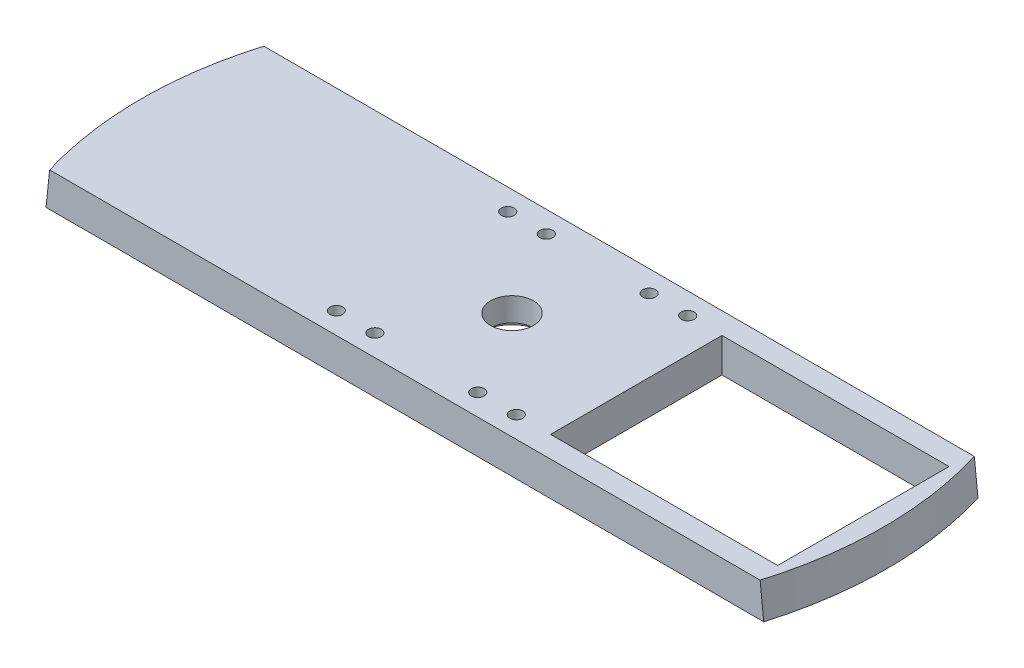
ISO-10303-21;
HEADER;
FILE_DESCRIPTION(('STEP AP214'),'2;1');
FILE_NAME('part.step','',(''),(''),'','','');
FILE_SCHEMA(('AUTOMOTIVE_DESIGN { 1 0 10303 214 1 1 1 1 }'));
ENDSEC;
DATA;
#1=APPLICATION_CONTEXT('core data for automotive mechanical design processes');
#2=APPLICATION_PROTOCOL_DEFINITION('international standard','automotive_design',2000,#1);
#3=PRODUCT_CONTEXT('',#1,'mechanical');
#4=PRODUCT('Part','Part','',(#3));
#5=PRODUCT_RELATED_PRODUCT_CATEGORY('part','',(#4));
#6=PRODUCT_DEFINITION_FORMATION('','',#4);
#7=PRODUCT_DEFINITION_CONTEXT('part definition',#1,'design');
#8=PRODUCT_DEFINITION('design','',#6,#7);
#9=PRODUCT_DEFINITION_SHAPE('','',#8);
#10=(LENGTH_UNIT() NAMED_UNIT(*) SI_UNIT(.MILLI.,.METRE.));
#11=(NAMED_UNIT(*) PLANE_ANGLE_UNIT() SI_UNIT($,.RADIAN.));
#12=(NAMED_UNIT(*) SI_UNIT($,.STERADIAN.) SOLID_ANGLE_UNIT());
#13=UNCERTAINTY_MEASURE_WITH_UNIT(LENGTH_MEASURE(1.E-05),#10,'distance_accuracy_value','');
#14=(GEOMETRIC_REPRESENTATION_CONTEXT(3) GLOBAL_UNCERTAINTY_ASSIGNED_CONTEXT((#13)) GLOBAL_UNIT_ASSIGNED_CONTEXT((#10,
#11,#12)) REPRESENTATION_CONTEXT('',''));
#15=CARTESIAN_POINT('',(0.,0.,0.));
#16=DIRECTION('',(0.,0.,1.));
#17=DIRECTION('',(1.,0.,0.));
#18=AXIS2_PLACEMENT_3D('',#15,#16,#17);
#19=CARTESIAN_POINT('',(0.,64.142135623731,0.));
#20=DIRECTION('',(0.,-1.,0.));
#21=DIRECTION('',(1.,0.,0.));
#22=AXIS2_PLACEMENT_3D('',#19,#20,#21);
#23=CYLINDRICAL_SURFACE('',#22,5.);
#24=CARTESIAN_POINT('',(0.,50.,0.));
#25=DIRECTION('',(0.,1.,0.));
#26=DIRECTION('',(-1.,0.,0.));
#27=AXIS2_PLACEMENT_3D('',#24,#25,#26);
#28=CIRCLE('',#27,5.);
#29=CARTESIAN_POINT('',(-5.00000000000001,50.,0.));
#30=VERTEX_POINT('',#29);
#31=EDGE_CURVE('E191',#30,#30,#28,.F.);
#32=ORIENTED_EDGE('',*,*,#31,.F.);
#33=EDGE_LOOP('',(#32));
#34=FACE_BOUND('',#33,.T.);
#35=CARTESIAN_POINT('',(0.,44.5,0.));
#36=DIRECTION('',(0.,-1.,0.));
#37=DIRECTION('',(1.,0.,0.));
#38=AXIS2_PLACEMENT_3D('',#35,#36,#37);
#39=CIRCLE('',#38,5.);
#40=CARTESIAN_POINT('',(4.99999999999999,44.5,0.));
#41=VERTEX_POINT('',#40);
#42=EDGE_CURVE('E39',#41,#41,#39,.F.);
#43=ORIENTED_EDGE('',*,*,#42,.F.);
#44=EDGE_LOOP('',(#43));
#45=FACE_BOUND('',#44,.T.);
#46=ADVANCED_FACE('F35',(#34,#45),#23,.F.);
#47=CARTESIAN_POINT('',(-87.4046785079811,42.,-25.));
#48=DIRECTION('',(0.,-1.,0.));
#49=DIRECTION('',(1.,0.,0.));
#50=AXIS2_PLACEMENT_3D('',#47,#48,#49);
#51=PLANE('',#50);
#52=DIRECTION('',(1.,0.,0.));
#53=VECTOR('',#52,1.);
#54=CARTESIAN_POINT('',(29.,42.,20.));
#55=LINE('',#54,#53);
#56=CARTESIAN_POINT('',(29.,42.,20.));
#57=VERTEX_POINT('',#56);
#58=CARTESIAN_POINT('',(82.,42.,20.));
#59=VERTEX_POINT('',#58);
#60=EDGE_CURVE('E115',#57,#59,#55,.T.);
#61=ORIENTED_EDGE('',*,*,#60,.T.);
#62=DIRECTION('',(0.,0.,-1.));
#63=VECTOR('',#62,1.);
#64=CARTESIAN_POINT('',(82.,42.,-20.));
#65=LINE('',#64,#63);
#66=CARTESIAN_POINT('',(82.,42.,-20.));
#67=VERTEX_POINT('',#66);
#68=EDGE_CURVE('E102',#59,#67,#65,.T.);
#69=ORIENTED_EDGE('',*,*,#68,.T.);
#70=DIRECTION('',(-1.,0.,0.));
#71=VECTOR('',#70,1.);
#72=CARTESIAN_POINT('',(29.,42.,-20.));
#73=LINE('',#72,#71);
#74=CARTESIAN_POINT('',(29.,42.,-20.));
#75=VERTEX_POINT('',#74);
#76=EDGE_CURVE('E132',#67,#75,#73,.T.);
#77=ORIENTED_EDGE('',*,*,#76,.T.);
#78=DIRECTION('',(0.,0.,1.));
#79=VECTOR('',#78,1.);
#80=CARTESIAN_POINT('',(29.,42.,-20.));
#81=LINE('',#80,#79);
#82=EDGE_CURVE('E122',#75,#57,#81,.T.);
#83=ORIENTED_EDGE('',*,*,#82,.T.);
#84=EDGE_LOOP('',(#61,#69,#77,#83));
#85=FACE_BOUND('',#84,.T.);
#86=CARTESIAN_POINT('',(21.,42.,-20.));
#87=DIRECTION('',(0.,-1.,0.));
#88=DIRECTION('',(1.,0.,0.));
#89=AXIS2_PLACEMENT_3D('',#86,#87,#88);
#90=CIRCLE('',#89,1.5);
#91=CARTESIAN_POINT('',(22.5,42.,-20.));
#92=VERTEX_POINT('',#91);
#93=EDGE_CURVE('E137',#92,#92,#90,.T.);
#94=ORIENTED_EDGE('',*,*,#93,.F.);
#95=EDGE_LOOP('',(#94));
#96=FACE_BOUND('',#95,.T.);
#97=CARTESIAN_POINT('',(-21.,42.,-20.));
#98=DIRECTION('',(0.,-1.,0.));
#99=DIRECTION('',(1.,0.,0.));
#100=AXIS2_PLACEMENT_3D('',#97,#98,#99);
#101=CIRCLE('',#100,1.5);
#102=CARTESIAN_POINT('',(-19.5,42.,-20.));
#103=VERTEX_POINT('',#102);
#104=EDGE_CURVE('E143',#103,#103,#101,.T.);
#105=ORIENTED_EDGE('',*,*,#104,.F.);
#106=EDGE_LOOP('',(#105));
#107=FACE_BOUND('',#106,.T.);
#108=CARTESIAN_POINT('',(-21.,42.,20.));
#109=DIRECTION('',(0.,-1.,0.));
#110=DIRECTION('',(1.,0.,0.));
#111=AXIS2_PLACEMENT_3D('',#108,#109,#110);
#112=CIRCLE('',#111,1.5);
#113=CARTESIAN_POINT('',(-19.5,42.,20.));
#114=VERTEX_POINT('',#113);
#115=EDGE_CURVE('E149',#114,#114,#112,.T.);
#116=ORIENTED_EDGE('',*,*,#115,.F.);
#117=EDGE_LOOP('',(#116));
#118=FACE_BOUND('',#117,.T.);
#119=CARTESIAN_POINT('',(21.,42.,20.));
#120=DIRECTION('',(0.,-1.,0.));
#121=DIRECTION('',(1.,0.,0.));
#122=AXIS2_PLACEMENT_3D('',#119,#120,#121);
#123=CIRCLE('',#122,1.5);
#124=CARTESIAN_POINT('',(22.5,42.,20.));
#125=VERTEX_POINT('',#124);
#126=EDGE_CURVE('E155',#125,#125,#123,.T.);
#127=ORIENTED_EDGE('',*,*,#126,.F.);
#128=EDGE_LOOP('',(#127));
#129=FACE_BOUND('',#128,.T.);
#130=CARTESIAN_POINT('',(12.,42.,-20.));
#131=DIRECTION('',(0.,-1.,0.));
#132=DIRECTION('',(1.,0.,0.));
#133=AXIS2_PLACEMENT_3D('',#130,#131,#132);
#134=CIRCLE('',#133,1.5);
#135=CARTESIAN_POINT('',(13.5,42.,-20.));
#136=VERTEX_POINT('',#135);
#137=EDGE_CURVE('E161',#136,#136,#134,.T.);
#138=ORIENTED_EDGE('',*,*,#137,.F.);
#139=EDGE_LOOP('',(#138));
#140=FACE_BOUND('',#139,.T.);
#141=CARTESIAN_POINT('',(-12.,42.,-20.));
#142=DIRECTION('',(0.,-1.,0.));
#143=DIRECTION('',(1.,0.,0.));
#144=AXIS2_PLACEMENT_3D('',#141,#142,#143);
#145=CIRCLE('',#144,1.5);
#146=CARTESIAN_POINT('',(-10.5,42.,-20.));
#147=VERTEX_POINT('',#146);
#148=EDGE_CURVE('E167',#147,#147,#145,.T.);
#149=ORIENTED_EDGE('',*,*,#148,.F.);
#150=EDGE_LOOP('',(#149));
#151=FACE_BOUND('',#150,.T.);
#152=CARTESIAN_POINT('',(-12.,42.,20.));
#153=DIRECTION('',(0.,-1.,0.));
#154=DIRECTION('',(1.,0.,0.));
#155=AXIS2_PLACEMENT_3D('',#152,#153,#154);
#156=CIRCLE('',#155,1.5);
#157=CARTESIAN_POINT('',(-10.5,42.,20.));
#158=VERTEX_POINT('',#157);
#159=EDGE_CURVE('E173',#158,#158,#156,.T.);
#160=ORIENTED_EDGE('',*,*,#159,.F.);
#161=EDGE_LOOP('',(#160));
#162=FACE_BOUND('',#161,.T.);
#163=CARTESIAN_POINT('',(12.,42.,20.));
#164=DIRECTION('',(0.,-1.,0.));
#165=DIRECTION('',(1.,0.,0.));
#166=AXIS2_PLACEMENT_3D('',#163,#164,#165);
#167=CIRCLE('',#166,1.5);
#168=CARTESIAN_POINT('',(13.5,42.,20.));
#169=VERTEX_POINT('',#168);
#170=EDGE_CURVE('E179',#169,#169,#167,.T.);
#171=ORIENTED_EDGE('',*,*,#170,.F.);
#172=EDGE_LOOP('',(#171));
#173=FACE_BOUND('',#172,.T.);
#174=CARTESIAN_POINT('',(0.,42.,0.));
#175=DIRECTION('',(0.,-1.,0.));
#176=DIRECTION('',(1.,0.,0.));
#177=AXIS2_PLACEMENT_3D('',#174,#175,#176);
#178=CIRCLE('',#177,8.);
#179=CARTESIAN_POINT('',(7.99999999999999,42.,0.));
#180=VERTEX_POINT('',#179);
#181=EDGE_CURVE('E185',#180,#180,#178,.T.);
#182=ORIENTED_EDGE('',*,*,#181,.F.);
#183=EDGE_LOOP('',(#182));
#184=FACE_BOUND('',#183,.T.);
#185=CARTESIAN_POINT('',(0.,42.,0.));
#186=DIRECTION('',(0.,-1.,0.));
#187=DIRECTION('',(1.,0.,0.));
#188=AXIS2_PLACEMENT_3D('',#185,#186,#187);
#189=CIRCLE('',#188,87.4046785079811);
#190=CARTESIAN_POINT('',(-83.7530765111559,42.,25.));
#191=VERTEX_POINT('',#190);
#192=CARTESIAN_POINT('',(-83.7530765111559,42.,-25.));
#193=VERTEX_POINT('',#192);
#194=EDGE_CURVE('E199',#191,#193,#189,.T.);
#195=ORIENTED_EDGE('',*,*,#194,.T.);
#196=DIRECTION('',(1.,0.,0.));
#197=VECTOR('',#196,1.);
#198=CARTESIAN_POINT('',(-87.4046785079811,42.,-25.));
#199=LINE('',#198,#197);
#200=CARTESIAN_POINT('',(83.7530765111559,42.,-25.));
#201=VERTEX_POINT('',#200);
#202=EDGE_CURVE('E241',#193,#201,#199,.T.);
#203=ORIENTED_EDGE('',*,*,#202,.T.);
#204=CARTESIAN_POINT('',(83.7530765111559,42.,25.));
#205=VERTEX_POINT('',#204);
#206=EDGE_CURVE('E197',#201,#205,#189,.T.);
#207=ORIENTED_EDGE('',*,*,#206,.T.);
#208=DIRECTION('',(1.,0.,0.));
#209=VECTOR('',#208,1.);
#210=CARTESIAN_POINT('',(-87.4046785079811,42.,25.));
#211=LINE('',#210,#209);
#212=EDGE_CURVE('E246',#191,#205,#211,.T.);
#213=ORIENTED_EDGE('',*,*,#212,.F.);
#214=EDGE_LOOP('',(#195,#203,#207,#213));
#215=FACE_BOUND('',#214,.T.);
#216=ADVANCED_FACE('F37',(#85,#96,#107,#118,#129,#140,#151,#162,#173,#184,#215),#51,.T.);
#217=CARTESIAN_POINT('',(-86.5920681414426,50.,-25.));
#218=DIRECTION('',(0.,1.,0.));
#219=DIRECTION('',(-1.,0.,0.));
#220=AXIS2_PLACEMENT_3D('',#217,#218,#219);
#221=PLANE('',#220);
#222=DIRECTION('',(1.,0.,0.));
#223=VECTOR('',#222,1.);
#224=CARTESIAN_POINT('',(29.,50.,20.));
#225=LINE('',#224,#223);
#226=CARTESIAN_POINT('',(29.,50.,20.));
#227=VERTEX_POINT('',#226);
#228=CARTESIAN_POINT('',(82.,50.,20.));
#229=VERTEX_POINT('',#228);
#230=EDGE_CURVE('E118',#227,#229,#225,.T.);
#231=ORIENTED_EDGE('',*,*,#230,.F.);
#232=DIRECTION('',(0.,0.,1.));
#233=VECTOR('',#232,1.);
#234=CARTESIAN_POINT('',(29.,50.,-20.));
#235=LINE('',#234,#233);
#236=CARTESIAN_POINT('',(29.,50.,-20.));
#237=VERTEX_POINT('',#236);
#238=EDGE_CURVE('E128',#237,#227,#235,.T.);
#239=ORIENTED_EDGE('',*,*,#238,.F.);
#240=DIRECTION('',(-1.,0.,0.));
#241=VECTOR('',#240,1.);
#242=CARTESIAN_POINT('',(29.,50.,-20.));
#243=LINE('',#242,#241);
#244=CARTESIAN_POINT('',(82.,50.,-20.));
#245=VERTEX_POINT('',#244);
#246=EDGE_CURVE('E59',#245,#237,#243,.T.);
#247=ORIENTED_EDGE('',*,*,#246,.F.);
#248=DIRECTION('',(0.,0.,-1.));
#249=VECTOR('',#248,1.);
#250=CARTESIAN_POINT('',(82.,50.,-20.));
#251=LINE('',#250,#249);
#252=EDGE_CURVE('E124',#229,#245,#251,.T.);
#253=ORIENTED_EDGE('',*,*,#252,.F.);
#254=EDGE_LOOP('',(#231,#239,#247,#253));
#255=FACE_BOUND('',#254,.T.);
#256=CARTESIAN_POINT('',(21.,50.,-20.));
#257=DIRECTION('',(0.,1.,0.));
#258=DIRECTION('',(-1.,0.,0.));
#259=AXIS2_PLACEMENT_3D('',#256,#257,#258);
#260=CIRCLE('',#259,1.5);
#261=CARTESIAN_POINT('',(19.5,50.,-20.));
#262=VERTEX_POINT('',#261);
#263=EDGE_CURVE('E140',#262,#262,#260,.F.);
#264=ORIENTED_EDGE('',*,*,#263,.T.);
#265=EDGE_LOOP('',(#264));
#266=FACE_BOUND('',#265,.T.);
#267=CARTESIAN_POINT('',(-21.,50.,-20.));
#268=DIRECTION('',(0.,1.,0.));
#269=DIRECTION('',(-1.,0.,0.));
#270=AXIS2_PLACEMENT_3D('',#267,#268,#269);
#271=CIRCLE('',#270,1.5);
#272=CARTESIAN_POINT('',(-22.5,50.,-20.));
#273=VERTEX_POINT('',#272);
#274=EDGE_CURVE('E146',#273,#273,#271,.F.);
#275=ORIENTED_EDGE('',*,*,#274,.T.);
#276=EDGE_LOOP('',(#275));
#277=FACE_BOUND('',#276,.T.);
#278=CARTESIAN_POINT('',(-21.,50.,20.));
#279=DIRECTION('',(0.,1.,0.));
#280=DIRECTION('',(-1.,0.,0.));
#281=AXIS2_PLACEMENT_3D('',#278,#279,#280);
#282=CIRCLE('',#281,1.5);
#283=CARTESIAN_POINT('',(-22.5,50.,20.));
#284=VERTEX_POINT('',#283);
#285=EDGE_CURVE('E152',#284,#284,#282,.F.);
#286=ORIENTED_EDGE('',*,*,#285,.T.);
#287=EDGE_LOOP('',(#286));
#288=FACE_BOUND('',#287,.T.);
#289=CARTESIAN_POINT('',(21.,50.,20.));
#290=DIRECTION('',(0.,1.,0.));
#291=DIRECTION('',(-1.,0.,0.));
#292=AXIS2_PLACEMENT_3D('',#289,#290,#291);
#293=CIRCLE('',#292,1.5);
#294=CARTESIAN_POINT('',(19.5,50.,20.));
#295=VERTEX_POINT('',#294);
#296=EDGE_CURVE('E158',#295,#295,#293,.F.);
#297=ORIENTED_EDGE('',*,*,#296,.T.);
#298=EDGE_LOOP('',(#297));
#299=FACE_BOUND('',#298,.T.);
#300=CARTESIAN_POINT('',(12.,50.,-20.));
#301=DIRECTION('',(0.,1.,0.));
#302=DIRECTION('',(-1.,0.,0.));
#303=AXIS2_PLACEMENT_3D('',#300,#301,#302);
#304=CIRCLE('',#303,1.5);
#305=CARTESIAN_POINT('',(10.5,50.,-20.));
#306=VERTEX_POINT('',#305);
#307=EDGE_CURVE('E164',#306,#306,#304,.F.);
#308=ORIENTED_EDGE('',*,*,#307,.T.);
#309=EDGE_LOOP('',(#308));
#310=FACE_BOUND('',#309,.T.);
#311=CARTESIAN_POINT('',(-12.,50.,-20.));
#312=DIRECTION('',(0.,1.,0.));
#313=DIRECTION('',(-1.,0.,0.));
#314=AXIS2_PLACEMENT_3D('',#311,#312,#313);
#315=CIRCLE('',#314,1.5);
#316=CARTESIAN_POINT('',(-13.5,50.,-20.));
#317=VERTEX_POINT('',#316);
#318=EDGE_CURVE('E170',#317,#317,#315,.F.);
#319=ORIENTED_EDGE('',*,*,#318,.T.);
#320=EDGE_LOOP('',(#319));
#321=FACE_BOUND('',#320,.T.);
#322=CARTESIAN_POINT('',(-12.,50.,20.));
#323=DIRECTION('',(0.,1.,0.));
#324=DIRECTION('',(-1.,0.,0.));
#325=AXIS2_PLACEMENT_3D('',#322,#323,#324);
#326=CIRCLE('',#325,1.5);
#327=CARTESIAN_POINT('',(-13.5,50.,20.));
#328=VERTEX_POINT('',#327);
#329=EDGE_CURVE('E176',#328,#328,#326,.F.);
#330=ORIENTED_EDGE('',*,*,#329,.T.);
#331=EDGE_LOOP('',(#330));
#332=FACE_BOUND('',#331,.T.);
#333=CARTESIAN_POINT('',(12.,50.,20.));
#334=DIRECTION('',(0.,1.,0.));
#335=DIRECTION('',(-1.,0.,0.));
#336=AXIS2_PLACEMENT_3D('',#333,#334,#335);
#337=CIRCLE('',#336,1.5);
#338=CARTESIAN_POINT('',(10.5,50.,20.));
#339=VERTEX_POINT('',#338);
#340=EDGE_CURVE('E182',#339,#339,#337,.F.);
#341=ORIENTED_EDGE('',*,*,#340,.T.);
#342=EDGE_LOOP('',(#341));
#343=FACE_BOUND('',#342,.T.);
#344=ORIENTED_EDGE('',*,*,#31,.T.);
#345=EDGE_LOOP('',(#344));
#346=FACE_BOUND('',#345,.T.);
#347=CARTESIAN_POINT('',(0.,50.,0.));
#348=DIRECTION('',(0.,-1.,0.));
#349=DIRECTION('',(1.,0.,0.));
#350=AXIS2_PLACEMENT_3D('',#347,#348,#349);
#351=CIRCLE('',#350,86.5920681414425);
#352=CARTESIAN_POINT('',(82.9046818039381,50.,-25.));
#353=VERTEX_POINT('',#352);
#354=CARTESIAN_POINT('',(82.9046818039381,50.,25.));
#355=VERTEX_POINT('',#354);
#356=EDGE_CURVE('E194',#353,#355,#351,.T.);
#357=ORIENTED_EDGE('',*,*,#356,.F.);
#358=DIRECTION('',(-1.,0.,0.));
#359=VECTOR('',#358,1.);
#360=CARTESIAN_POINT('',(-86.5920681414426,50.,-25.));
#361=LINE('',#360,#359);
#362=CARTESIAN_POINT('',(-82.9046818039381,50.,-25.));
#363=VERTEX_POINT('',#362);
#364=EDGE_CURVE('E238',#353,#363,#361,.T.);
#365=ORIENTED_EDGE('',*,*,#364,.T.);
#366=CARTESIAN_POINT('',(-82.9046818039381,50.,25.));
#367=VERTEX_POINT('',#366);
#368=EDGE_CURVE('E196',#367,#363,#351,.T.);
#369=ORIENTED_EDGE('',*,*,#368,.F.);
#370=DIRECTION('',(-1.,0.,0.));
#371=VECTOR('',#370,1.);
#372=CARTESIAN_POINT('',(-86.5920681414426,50.,25.));
#373=LINE('',#372,#371);
#374=EDGE_CURVE('E244',#355,#367,#373,.T.);
#375=ORIENTED_EDGE('',*,*,#374,.F.);
#376=EDGE_LOOP('',(#357,#365,#369,#375));
#377=FACE_BOUND('',#376,.T.);
#378=ADVANCED_FACE('F259',(#255,#266,#277,#288,#299,#310,#321,#332,#343,#346,#377),#221,.T.);
#379=CARTESIAN_POINT('',(0.,0.,-25.));
#380=DIRECTION('',(0.,0.,1.));
#381=DIRECTION('',(1.,0.,0.));
#382=AXIS2_PLACEMENT_3D('',#379,#380,#381);
#383=PLANE('',#382);
#384=ORIENTED_EDGE('',*,*,#202,.F.);
#385=CARTESIAN_POINT('',(-99.6441362385158,-108.898983920911,-25.));
#386=CARTESIAN_POINT('',(-98.2755683494716,-95.8308591136206,-25.));
#387=CARTESIAN_POINT('',(-96.9053780668794,-82.7629040560096,-25.));
#388=CARTESIAN_POINT('',(-94.1612427251718,-56.6273878959122,-25.));
#389=CARTESIAN_POINT('',(-92.787297665969,-43.5598267934349,-25.));
#390=CARTESIAN_POINT('',(-90.0351439888024,-17.4251644667499,-25.));
#391=CARTESIAN_POINT('',(-88.6569353743825,-4.35806324216902,-25.));
#392=CARTESIAN_POINT('',(-85.8956145308367,21.7756210523798,-25.));
#393=CARTESIAN_POINT('',(-84.5125023017524,34.8422041223521,-25.));
#394=CARTESIAN_POINT('',(-81.7406059368029,60.9747752834534,-25.));
#395=CARTESIAN_POINT('',(-80.3518217981445,74.040763374286,-25.));
#396=CARTESIAN_POINT('',(-77.5676385833807,100.172034336622,-25.));
#397=CARTESIAN_POINT('',(-76.1722395075564,113.237317208156,-25.));
#398=CARTESIAN_POINT('',(-73.3736579130146,139.367060567633,-25.));
#399=CARTESIAN_POINT('',(-71.9704753879137,152.431521054894,-25.));
#400=CARTESIAN_POINT('',(-69.8587544551281,172.027464053339,-25.));
#401=CARTESIAN_POINT('',(-69.1536895648329,178.559320939387,-25.));
#402=CARTESIAN_POINT('',(-67.7410132325902,191.622759511745,-25.));
#403=CARTESIAN_POINT('',(-67.033401790566,198.154341198047,-25.));
#404=CARTESIAN_POINT('',(-66.3244016576602,204.685772279796,-25.));
#405=B_SPLINE_CURVE_WITH_KNOTS('',3,(#385,#386,#387,#388,#389,#390,#391,#392,#393,#394,#395,
#396,#397,#398,#399,#400,#401,#402,#403,#404),.UNSPECIFIED.,.F.,.F.,(4,2,2,2,2,2,2,2,2,4),(0.,
39.418774545404,78.8375500086314,118.256292715268,157.675035086381,197.093796871865,
236.512556981421,275.931349423553,295.64074871437,315.350148598059),.UNSPECIFIED.);
#406=EDGE_CURVE('E208',#193,#363,#405,.T.);
#407=ORIENTED_EDGE('',*,*,#406,.T.);
#408=ORIENTED_EDGE('',*,*,#364,.F.);
#409=CARTESIAN_POINT('',(66.3244016576602,204.685772279796,-25.));
#410=CARTESIAN_POINT('',(67.4822322752226,194.019377280341,-25.));
#411=CARTESIAN_POINT('',(68.6364052277135,183.352585860173,-25.));
#412=CARTESIAN_POINT('',(70.9383328111043,162.018311240133,-25.));
#413=CARTESIAN_POINT('',(72.0860874425014,151.350828040315,-25.));
#414=CARTESIAN_POINT('',(74.3760751410753,130.01527327905,-25.));
#415=CARTESIAN_POINT('',(75.518308210327,119.347201717825,-25.));
#416=CARTESIAN_POINT('',(77.7979496259795,98.0105430780764,-25.));
#417=CARTESIAN_POINT('',(78.9353579723444,87.3419559995486,-25.));
#418=CARTESIAN_POINT('',(80.5807914150479,71.8791219262765,-25.));
#419=CARTESIAN_POINT('',(81.0905061210802,67.08505464833,-25.));
#420=CARTESIAN_POINT('',(82.1091260353078,57.4968339175061,-25.));
#421=CARTESIAN_POINT('',(82.6180312434738,52.7026804646256,-25.));
#422=CARTESIAN_POINT('',(84.5125039953821,34.8421982765181,-25.));
#423=CARTESIAN_POINT('',(85.8956160916492,21.77560903587,-25.));
#424=CARTESIAN_POINT('',(88.65693766782,-4.35808770301016,-25.));
#425=CARTESIAN_POINT('',(90.0351471475785,-17.4251952012575,-25.));
#426=CARTESIAN_POINT('',(92.7873010202453,-43.5598578931548,-25.));
#427=CARTESIAN_POINT('',(94.1612454135997,-56.6274130867576,-25.));
#428=CARTESIAN_POINT('',(96.9053793738766,-82.7629169179596,-25.));
#429=CARTESIAN_POINT('',(98.2755689410331,-95.830865555534,-25.));
#430=CARTESIAN_POINT('',(99.6441362385159,-108.898983920911,-25.));
#431=B_SPLINE_CURVE_WITH_KNOTS('',3,(#409,#410,#411,#412,#413,#414,#415,#416,#417,#418,#419,
#420,#421,#422,#423,#424,#425,#426,#427,#428,#429,#430),.UNSPECIFIED.,.F.,.F.,(4,2,2,2,2,2,2,2,
2,2,4),(0.,32.1871540914093,64.3743056892512,96.5614451908537,128.748584931559,143.211849079579,
157.675113749277,197.093874321975,236.51263606191,275.931393678013,315.350148835658),.UNSPECIFIED.);
#432=EDGE_CURVE('E200',#353,#201,#431,.T.);
#433=ORIENTED_EDGE('',*,*,#432,.T.);
#434=EDGE_LOOP('',(#384,#407,#408,#433));
#435=FACE_BOUND('',#434,.T.);
#436=ADVANCED_FACE('F213',(#435),#383,.F.);
#437=CARTESIAN_POINT('',(0.,0.,25.));
#438=DIRECTION('',(0.,0.,1.));
#439=DIRECTION('',(1.,0.,0.));
#440=AXIS2_PLACEMENT_3D('',#437,#438,#439);
#441=PLANE('',#440);
#442=CARTESIAN_POINT('',(-99.6441362385158,-108.898983920911,25.));
#443=CARTESIAN_POINT('',(-98.2755683494716,-95.8308591136206,25.));
#444=CARTESIAN_POINT('',(-96.9053780668794,-82.7629040560096,25.));
#445=CARTESIAN_POINT('',(-94.1612427251718,-56.6273878959122,25.));
#446=CARTESIAN_POINT('',(-92.787297665969,-43.5598267934349,25.));
#447=CARTESIAN_POINT('',(-90.0351439888024,-17.4251644667499,25.));
#448=CARTESIAN_POINT('',(-88.6569353743825,-4.35806324216902,25.));
#449=CARTESIAN_POINT('',(-85.8956145308367,21.7756210523798,25.));
#450=CARTESIAN_POINT('',(-84.5125023017524,34.8422041223521,25.));
#451=CARTESIAN_POINT('',(-81.7406059368029,60.9747752834534,25.));
#452=CARTESIAN_POINT('',(-80.3518217981445,74.040763374286,25.));
#453=CARTESIAN_POINT('',(-77.5676385833807,100.172034336622,25.));
#454=CARTESIAN_POINT('',(-76.1722395075564,113.237317208156,25.));
#455=CARTESIAN_POINT('',(-73.3736579130146,139.367060567633,25.));
#456=CARTESIAN_POINT('',(-71.9704753879137,152.431521054894,25.));
#457=CARTESIAN_POINT('',(-69.8587544551281,172.027464053339,25.));
#458=CARTESIAN_POINT('',(-69.1536895648329,178.559320939387,25.));
#459=CARTESIAN_POINT('',(-67.7410132325902,191.622759511745,25.));
#460=CARTESIAN_POINT('',(-67.033401790566,198.154341198047,25.));
#461=CARTESIAN_POINT('',(-66.3244016576602,204.685772279796,25.));
#462=B_SPLINE_CURVE_WITH_KNOTS('',3,(#442,#443,#444,#445,#446,#447,#448,#449,#450,#451,#452,
#453,#454,#455,#456,#457,#458,#459,#460,#461),.UNSPECIFIED.,.F.,.F.,(4,2,2,2,2,2,2,2,2,4),(0.,
39.418774545404,78.8375500086314,118.256292715268,157.675035086381,197.093796871865,
236.512556981421,275.931349423553,295.64074871437,315.350148598059),.UNSPECIFIED.);
#463=EDGE_CURVE('E11',#191,#367,#462,.T.);
#464=ORIENTED_EDGE('',*,*,#463,.F.);
#465=ORIENTED_EDGE('',*,*,#212,.T.);
#466=CARTESIAN_POINT('',(66.3244016576602,204.685772279796,25.));
#467=CARTESIAN_POINT('',(67.4822322752226,194.019377280341,25.));
#468=CARTESIAN_POINT('',(68.6364052277135,183.352585860173,25.));
#469=CARTESIAN_POINT('',(70.9383328111043,162.018311240133,25.));
#470=CARTESIAN_POINT('',(72.0860874425014,151.350828040315,25.));
#471=CARTESIAN_POINT('',(74.3760751410753,130.01527327905,25.));
#472=CARTESIAN_POINT('',(75.518308210327,119.347201717825,25.));
#473=CARTESIAN_POINT('',(77.7979496259795,98.0105430780764,25.));
#474=CARTESIAN_POINT('',(78.9353579723444,87.3419559995486,25.));
#475=CARTESIAN_POINT('',(80.5807914150479,71.8791219262765,25.));
#476=CARTESIAN_POINT('',(81.0905061210802,67.08505464833,25.));
#477=CARTESIAN_POINT('',(82.1091260353078,57.4968339175061,25.));
#478=CARTESIAN_POINT('',(82.6180312434738,52.7026804646256,25.));
#479=CARTESIAN_POINT('',(84.5125039953821,34.8421982765181,25.));
#480=CARTESIAN_POINT('',(85.8956160916492,21.77560903587,25.));
#481=CARTESIAN_POINT('',(88.65693766782,-4.35808770301016,25.));
#482=CARTESIAN_POINT('',(90.0351471475785,-17.4251952012575,25.));
#483=CARTESIAN_POINT('',(92.7873010202453,-43.5598578931548,25.));
#484=CARTESIAN_POINT('',(94.1612454135997,-56.6274130867576,25.));
#485=CARTESIAN_POINT('',(96.9053793738766,-82.7629169179596,25.));
#486=CARTESIAN_POINT('',(98.2755689410331,-95.830865555534,25.));
#487=CARTESIAN_POINT('',(99.6441362385159,-108.898983920911,25.));
#488=B_SPLINE_CURVE_WITH_KNOTS('',3,(#466,#467,#468,#469,#470,#471,#472,#473,#474,#475,#476,
#477,#478,#479,#480,#481,#482,#483,#484,#485,#486,#487),.UNSPECIFIED.,.F.,.F.,(4,2,2,2,2,2,2,2,
2,2,4),(0.,32.1871540914093,64.3743056892512,96.5614451908537,128.748584931559,143.211849079579,
157.675113749277,197.093874321975,236.51263606191,275.931393678013,315.350148835658),.UNSPECIFIED.);
#489=EDGE_CURVE('E44',#355,#205,#488,.T.);
#490=ORIENTED_EDGE('',*,*,#489,.F.);
#491=ORIENTED_EDGE('',*,*,#374,.T.);
#492=EDGE_LOOP('',(#464,#465,#490,#491));
#493=FACE_BOUND('',#492,.T.);
#494=ADVANCED_FACE('F224',(#493),#441,.T.);
#495=CARTESIAN_POINT('',(0.,50.,0.));
#496=DIRECTION('',(0.,-1.,0.));
#497=DIRECTION('',(1.,0.,0.));
#498=AXIS2_PLACEMENT_3D('',#495,#496,#497);
#499=CONICAL_SURFACE('',#498,86.5920681414425,0.101229096615664);
#500=ORIENTED_EDGE('',*,*,#206,.F.);
#501=ORIENTED_EDGE('',*,*,#432,.F.);
#502=ORIENTED_EDGE('',*,*,#356,.T.);
#503=ORIENTED_EDGE('',*,*,#489,.T.);
#504=EDGE_LOOP('',(#500,#501,#502,#503));
#505=FACE_BOUND('',#504,.T.);
#506=ADVANCED_FACE('F221',(#505),#499,.T.);
#507=ORIENTED_EDGE('',*,*,#194,.F.);
#508=ORIENTED_EDGE('',*,*,#463,.T.);
#509=ORIENTED_EDGE('',*,*,#368,.T.);
#510=ORIENTED_EDGE('',*,*,#406,.F.);
#511=EDGE_LOOP('',(#507,#508,#509,#510));
#512=FACE_BOUND('',#511,.T.);
#513=ADVANCED_FACE('F216',(#512),#499,.T.);
#514=CARTESIAN_POINT('',(0.,44.5,0.));
#515=DIRECTION('',(0.,-1.,0.));
#516=DIRECTION('',(1.,0.,0.));
#517=AXIS2_PLACEMENT_3D('',#514,#515,#516);
#518=PLANE('',#517);
#519=CARTESIAN_POINT('',(0.,44.5,0.));
#520=DIRECTION('',(0.,-1.,0.));
#521=DIRECTION('',(1.,0.,0.));
#522=AXIS2_PLACEMENT_3D('',#519,#520,#521);
#523=CIRCLE('',#522,8.);
#524=CARTESIAN_POINT('',(7.99999999999999,44.5,0.));
#525=VERTEX_POINT('',#524);
#526=EDGE_CURVE('E186',#525,#525,#523,.T.);
#527=ORIENTED_EDGE('',*,*,#526,.T.);
#528=EDGE_LOOP('',(#527));
#529=FACE_BOUND('',#528,.T.);
#530=ORIENTED_EDGE('',*,*,#42,.T.);
#531=EDGE_LOOP('',(#530));
#532=FACE_BOUND('',#531,.T.);
#533=ADVANCED_FACE('F220',(#529,#532),#518,.T.);
#534=CARTESIAN_POINT('',(0.,44.5,0.));
#535=DIRECTION('',(0.,-1.,0.));
#536=DIRECTION('',(1.,0.,0.));
#537=AXIS2_PLACEMENT_3D('',#534,#535,#536);
#538=CYLINDRICAL_SURFACE('',#537,8.);
#539=ORIENTED_EDGE('',*,*,#526,.F.);
#540=EDGE_LOOP('',(#539));
#541=FACE_BOUND('',#540,.T.);
#542=ORIENTED_EDGE('',*,*,#181,.T.);
#543=EDGE_LOOP('',(#542));
#544=FACE_BOUND('',#543,.T.);
#545=ADVANCED_FACE('F278',(#541,#544),#538,.F.);
#546=CARTESIAN_POINT('',(12.,54.2426406871193,20.));
#547=DIRECTION('',(0.,-1.,0.));
#548=DIRECTION('',(1.,0.,0.));
#549=AXIS2_PLACEMENT_3D('',#546,#547,#548);
#550=CYLINDRICAL_SURFACE('',#549,1.5);
#551=ORIENTED_EDGE('',*,*,#170,.T.);
#552=EDGE_LOOP('',(#551));
#553=FACE_BOUND('',#552,.T.);
#554=ORIENTED_EDGE('',*,*,#340,.F.);
#555=EDGE_LOOP('',(#554));
#556=FACE_BOUND('',#555,.T.);
#557=ADVANCED_FACE('F284',(#553,#556),#550,.F.);
#558=CARTESIAN_POINT('',(-12.,54.2426406871193,20.));
#559=DIRECTION('',(0.,-1.,0.));
#560=DIRECTION('',(1.,0.,0.));
#561=AXIS2_PLACEMENT_3D('',#558,#559,#560);
#562=CYLINDRICAL_SURFACE('',#561,1.5);
#563=ORIENTED_EDGE('',*,*,#159,.T.);
#564=EDGE_LOOP('',(#563));
#565=FACE_BOUND('',#564,.T.);
#566=ORIENTED_EDGE('',*,*,#329,.F.);
#567=EDGE_LOOP('',(#566));
#568=FACE_BOUND('',#567,.T.);
#569=ADVANCED_FACE('F289',(#565,#568),#562,.F.);
#570=CARTESIAN_POINT('',(-12.,54.2426406871193,-20.));
#571=DIRECTION('',(0.,-1.,0.));
#572=DIRECTION('',(1.,0.,0.));
#573=AXIS2_PLACEMENT_3D('',#570,#571,#572);
#574=CYLINDRICAL_SURFACE('',#573,1.5);
#575=ORIENTED_EDGE('',*,*,#148,.T.);
#576=EDGE_LOOP('',(#575));
#577=FACE_BOUND('',#576,.T.);
#578=ORIENTED_EDGE('',*,*,#318,.F.);
#579=EDGE_LOOP('',(#578));
#580=FACE_BOUND('',#579,.T.);
#581=ADVANCED_FACE('F293',(#577,#580),#574,.F.);
#582=CARTESIAN_POINT('',(12.,54.2426406871193,-20.));
#583=DIRECTION('',(0.,-1.,0.));
#584=DIRECTION('',(1.,0.,0.));
#585=AXIS2_PLACEMENT_3D('',#582,#583,#584);
#586=CYLINDRICAL_SURFACE('',#585,1.5);
#587=ORIENTED_EDGE('',*,*,#137,.T.);
#588=EDGE_LOOP('',(#587));
#589=FACE_BOUND('',#588,.T.);
#590=ORIENTED_EDGE('',*,*,#307,.F.);
#591=EDGE_LOOP('',(#590));
#592=FACE_BOUND('',#591,.T.);
#593=ADVANCED_FACE('F297',(#589,#592),#586,.F.);
#594=CARTESIAN_POINT('',(21.,54.2426406871193,20.));
#595=DIRECTION('',(0.,-1.,0.));
#596=DIRECTION('',(1.,0.,0.));
#597=AXIS2_PLACEMENT_3D('',#594,#595,#596);
#598=CYLINDRICAL_SURFACE('',#597,1.5);
#599=ORIENTED_EDGE('',*,*,#126,.T.);
#600=EDGE_LOOP('',(#599));
#601=FACE_BOUND('',#600,.T.);
#602=ORIENTED_EDGE('',*,*,#296,.F.);
#603=EDGE_LOOP('',(#602));
#604=FACE_BOUND('',#603,.T.);
#605=ADVANCED_FACE('F301',(#601,#604),#598,.F.);
#606=CARTESIAN_POINT('',(-21.,54.2426406871193,20.));
#607=DIRECTION('',(0.,-1.,0.));
#608=DIRECTION('',(1.,0.,0.));
#609=AXIS2_PLACEMENT_3D('',#606,#607,#608);
#610=CYLINDRICAL_SURFACE('',#609,1.5);
#611=ORIENTED_EDGE('',*,*,#115,.T.);
#612=EDGE_LOOP('',(#611));
#613=FACE_BOUND('',#612,.T.);
#614=ORIENTED_EDGE('',*,*,#285,.F.);
#615=EDGE_LOOP('',(#614));
#616=FACE_BOUND('',#615,.T.);
#617=ADVANCED_FACE('F305',(#613,#616),#610,.F.);
#618=CARTESIAN_POINT('',(-21.,54.2426406871193,-20.));
#619=DIRECTION('',(0.,-1.,0.));
#620=DIRECTION('',(1.,0.,0.));
#621=AXIS2_PLACEMENT_3D('',#618,#619,#620);
#622=CYLINDRICAL_SURFACE('',#621,1.5);
#623=ORIENTED_EDGE('',*,*,#104,.T.);
#624=EDGE_LOOP('',(#623));
#625=FACE_BOUND('',#624,.T.);
#626=ORIENTED_EDGE('',*,*,#274,.F.);
#627=EDGE_LOOP('',(#626));
#628=FACE_BOUND('',#627,.T.);
#629=ADVANCED_FACE('F309',(#625,#628),#622,.F.);
#630=CARTESIAN_POINT('',(21.,54.2426406871193,-20.));
#631=DIRECTION('',(0.,-1.,0.));
#632=DIRECTION('',(1.,0.,0.));
#633=AXIS2_PLACEMENT_3D('',#630,#631,#632);
#634=CYLINDRICAL_SURFACE('',#633,1.5);
#635=ORIENTED_EDGE('',*,*,#93,.T.);
#636=EDGE_LOOP('',(#635));
#637=FACE_BOUND('',#636,.T.);
#638=ORIENTED_EDGE('',*,*,#263,.F.);
#639=EDGE_LOOP('',(#638));
#640=FACE_BOUND('',#639,.T.);
#641=ADVANCED_FACE('F313',(#637,#640),#634,.F.);
#642=CARTESIAN_POINT('',(29.,-24.4003012041361,20.));
#643=DIRECTION('',(0.,0.,1.));
#644=DIRECTION('',(1.,0.,0.));
#645=AXIS2_PLACEMENT_3D('',#642,#643,#644);
#646=PLANE('',#645);
#647=DIRECTION('',(0.,1.,0.));
#648=VECTOR('',#647,1.);
#649=CARTESIAN_POINT('',(29.,-24.4003012041361,20.));
#650=LINE('',#649,#648);
#651=EDGE_CURVE('E51',#57,#227,#650,.T.);
#652=ORIENTED_EDGE('',*,*,#651,.T.);
#653=ORIENTED_EDGE('',*,*,#230,.T.);
#654=DIRECTION('',(0.,1.,0.));
#655=VECTOR('',#654,1.);
#656=CARTESIAN_POINT('',(82.,-24.4003012041361,20.));
#657=LINE('',#656,#655);
#658=EDGE_CURVE('E106',#59,#229,#657,.T.);
#659=ORIENTED_EDGE('',*,*,#658,.F.);
#660=ORIENTED_EDGE('',*,*,#60,.F.);
#661=EDGE_LOOP('',(#652,#653,#659,#660));
#662=FACE_BOUND('',#661,.T.);
#663=ADVANCED_FACE('F114',(#662),#646,.F.);
#664=CARTESIAN_POINT('',(82.,-24.4003012041361,-20.));
#665=DIRECTION('',(1.,0.,0.));
#666=DIRECTION('',(0.,1.,0.));
#667=AXIS2_PLACEMENT_3D('',#664,#665,#666);
#668=PLANE('',#667);
#669=ORIENTED_EDGE('',*,*,#658,.T.);
#670=ORIENTED_EDGE('',*,*,#252,.T.);
#671=DIRECTION('',(0.,1.,0.));
#672=VECTOR('',#671,1.);
#673=CARTESIAN_POINT('',(82.,-24.4003012041361,-20.));
#674=LINE('',#673,#672);
#675=EDGE_CURVE('E108',#67,#245,#674,.T.);
#676=ORIENTED_EDGE('',*,*,#675,.F.);
#677=ORIENTED_EDGE('',*,*,#68,.F.);
#678=EDGE_LOOP('',(#669,#670,#676,#677));
#679=FACE_BOUND('',#678,.T.);
#680=ADVANCED_FACE('F104',(#679),#668,.F.);
#681=CARTESIAN_POINT('',(29.,-24.4003012041361,-20.));
#682=DIRECTION('',(0.,0.,-1.));
#683=DIRECTION('',(-1.,0.,0.));
#684=AXIS2_PLACEMENT_3D('',#681,#682,#683);
#685=PLANE('',#684);
#686=ORIENTED_EDGE('',*,*,#675,.T.);
#687=ORIENTED_EDGE('',*,*,#246,.T.);
#688=DIRECTION('',(0.,1.,0.));
#689=VECTOR('',#688,1.);
#690=CARTESIAN_POINT('',(29.,-24.4003012041361,-20.));
#691=LINE('',#690,#689);
#692=EDGE_CURVE('E131',#75,#237,#691,.T.);
#693=ORIENTED_EDGE('',*,*,#692,.F.);
#694=ORIENTED_EDGE('',*,*,#76,.F.);
#695=EDGE_LOOP('',(#686,#687,#693,#694));
#696=FACE_BOUND('',#695,.T.);
#697=ADVANCED_FACE('F322',(#696),#685,.F.);
#698=CARTESIAN_POINT('',(29.,-24.4003012041361,-20.));
#699=DIRECTION('',(-1.,0.,0.));
#700=DIRECTION('',(0.,-1.,0.));
#701=AXIS2_PLACEMENT_3D('',#698,#699,#700);
#702=PLANE('',#701);
#703=ORIENTED_EDGE('',*,*,#692,.T.);
#704=ORIENTED_EDGE('',*,*,#238,.T.);
#705=ORIENTED_EDGE('',*,*,#651,.F.);
#706=ORIENTED_EDGE('',*,*,#82,.F.);
#707=EDGE_LOOP('',(#703,#704,#705,#706));
#708=FACE_BOUND('',#707,.T.);
#709=ADVANCED_FACE('F325',(#708),#702,.F.);
#710=CLOSED_SHELL('',(#46,#216,#378,#436,#494,#506,#513,#533,#545,#557,#569,#581,#593,#605,#617,
#629,#641,#663,#680,#697,#709));
#711=MANIFOLD_SOLID_BREP('B2',#710);
#712=ADVANCED_BREP_SHAPE_REPRESENTATION('',(#18,#711),#14);
#713=SHAPE_DEFINITION_REPRESENTATION(#9,#712);
ENDSEC;
END-ISO-10303-21;
